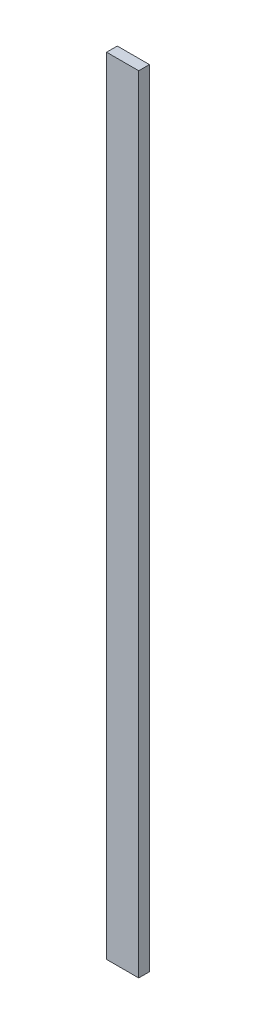
ISO-10303-21;
HEADER;
FILE_DESCRIPTION(('STEP AP214'),'2;1');
FILE_NAME('part.step','',(''),(''),'','','');
FILE_SCHEMA(('AUTOMOTIVE_DESIGN { 1 0 10303 214 1 1 1 1 }'));
ENDSEC;
DATA;
#1=APPLICATION_CONTEXT('core data for automotive mechanical design processes');
#2=APPLICATION_PROTOCOL_DEFINITION('international standard','automotive_design',2000,#1);
#3=PRODUCT_CONTEXT('',#1,'mechanical');
#4=PRODUCT('Part','Part','',(#3));
#5=PRODUCT_RELATED_PRODUCT_CATEGORY('part','',(#4));
#6=PRODUCT_DEFINITION_FORMATION('','',#4);
#7=PRODUCT_DEFINITION_CONTEXT('part definition',#1,'design');
#8=PRODUCT_DEFINITION('design','',#6,#7);
#9=PRODUCT_DEFINITION_SHAPE('','',#8);
#10=(LENGTH_UNIT() NAMED_UNIT(*) SI_UNIT(.MILLI.,.METRE.));
#11=(NAMED_UNIT(*) PLANE_ANGLE_UNIT() SI_UNIT($,.RADIAN.));
#12=(NAMED_UNIT(*) SI_UNIT($,.STERADIAN.) SOLID_ANGLE_UNIT());
#13=UNCERTAINTY_MEASURE_WITH_UNIT(LENGTH_MEASURE(1.E-05),#10,'distance_accuracy_value','');
#14=(GEOMETRIC_REPRESENTATION_CONTEXT(3) GLOBAL_UNCERTAINTY_ASSIGNED_CONTEXT((#13)) GLOBAL_UNIT_ASSIGNED_CONTEXT((#10,
#11,#12)) REPRESENTATION_CONTEXT('',''));
#15=CARTESIAN_POINT('',(0.,0.,0.));
#16=DIRECTION('',(0.,0.,1.));
#17=DIRECTION('',(1.,0.,0.));
#18=AXIS2_PLACEMENT_3D('',#15,#16,#17);
#19=CARTESIAN_POINT('',(2.25,110.,-0.75));
#20=DIRECTION('',(-1.,0.,0.));
#21=DIRECTION('',(0.,0.,1.));
#22=AXIS2_PLACEMENT_3D('',#19,#20,#21);
#23=PLANE('',#22);
#24=DIRECTION('',(0.,0.,-1.));
#25=VECTOR('',#24,1.);
#26=CARTESIAN_POINT('',(2.25,0.,-0.75));
#27=LINE('',#26,#25);
#28=CARTESIAN_POINT('',(2.25,0.,0.75));
#29=VERTEX_POINT('',#28);
#30=CARTESIAN_POINT('',(2.25,0.,-0.75));
#31=VERTEX_POINT('',#30);
#32=EDGE_CURVE('E96',#29,#31,#27,.T.);
#33=ORIENTED_EDGE('',*,*,#32,.T.);
#34=DIRECTION('',(0.,-1.,0.));
#35=VECTOR('',#34,1.);
#36=CARTESIAN_POINT('',(2.25,110.,-0.75));
#37=LINE('',#36,#35);
#38=CARTESIAN_POINT('',(2.25,110.,-0.75));
#39=VERTEX_POINT('',#38);
#40=EDGE_CURVE('E11',#39,#31,#37,.T.);
#41=ORIENTED_EDGE('',*,*,#40,.F.);
#42=DIRECTION('',(0.,0.,-1.));
#43=VECTOR('',#42,1.);
#44=CARTESIAN_POINT('',(2.25,110.,-0.75));
#45=LINE('',#44,#43);
#46=CARTESIAN_POINT('',(2.25,110.,0.75));
#47=VERTEX_POINT('',#46);
#48=EDGE_CURVE('E84',#47,#39,#45,.T.);
#49=ORIENTED_EDGE('',*,*,#48,.F.);
#50=DIRECTION('',(0.,-1.,0.));
#51=VECTOR('',#50,1.);
#52=CARTESIAN_POINT('',(2.25,110.,0.75));
#53=LINE('',#52,#51);
#54=EDGE_CURVE('E92',#47,#29,#53,.T.);
#55=ORIENTED_EDGE('',*,*,#54,.T.);
#56=EDGE_LOOP('',(#33,#41,#49,#55));
#57=FACE_BOUND('',#56,.T.);
#58=ADVANCED_FACE('F33',(#57),#23,.F.);
#59=CARTESIAN_POINT('',(-2.25,110.,-0.75));
#60=DIRECTION('',(0.,0.,1.));
#61=DIRECTION('',(1.,0.,0.));
#62=AXIS2_PLACEMENT_3D('',#59,#60,#61);
#63=PLANE('',#62);
#64=DIRECTION('',(-1.,0.,0.));
#65=VECTOR('',#64,1.);
#66=CARTESIAN_POINT('',(-2.25,0.,-0.75));
#67=LINE('',#66,#65);
#68=CARTESIAN_POINT('',(-2.25,0.,-0.75));
#69=VERTEX_POINT('',#68);
#70=EDGE_CURVE('E88',#31,#69,#67,.T.);
#71=ORIENTED_EDGE('',*,*,#70,.T.);
#72=DIRECTION('',(0.,-1.,0.));
#73=VECTOR('',#72,1.);
#74=CARTESIAN_POINT('',(-2.25,110.,-0.75));
#75=LINE('',#74,#73);
#76=CARTESIAN_POINT('',(-2.25,110.,-0.75));
#77=VERTEX_POINT('',#76);
#78=EDGE_CURVE('E41',#77,#69,#75,.T.);
#79=ORIENTED_EDGE('',*,*,#78,.F.);
#80=DIRECTION('',(-1.,0.,0.));
#81=VECTOR('',#80,1.);
#82=CARTESIAN_POINT('',(-2.25,110.,-0.75));
#83=LINE('',#82,#81);
#84=EDGE_CURVE('E79',#39,#77,#83,.T.);
#85=ORIENTED_EDGE('',*,*,#84,.F.);
#86=ORIENTED_EDGE('',*,*,#40,.T.);
#87=EDGE_LOOP('',(#71,#79,#85,#86));
#88=FACE_BOUND('',#87,.T.);
#89=ADVANCED_FACE('F87',(#88),#63,.F.);
#90=CARTESIAN_POINT('',(-2.25,110.,-0.75));
#91=DIRECTION('',(1.,0.,0.));
#92=DIRECTION('',(0.,0.,-1.));
#93=AXIS2_PLACEMENT_3D('',#90,#91,#92);
#94=PLANE('',#93);
#95=DIRECTION('',(0.,0.,1.));
#96=VECTOR('',#95,1.);
#97=CARTESIAN_POINT('',(-2.25,0.,-0.75));
#98=LINE('',#97,#96);
#99=CARTESIAN_POINT('',(-2.25,0.,0.75));
#100=VERTEX_POINT('',#99);
#101=EDGE_CURVE('E66',#69,#100,#98,.T.);
#102=ORIENTED_EDGE('',*,*,#101,.T.);
#103=DIRECTION('',(0.,-1.,0.));
#104=VECTOR('',#103,1.);
#105=CARTESIAN_POINT('',(-2.25,110.,0.75));
#106=LINE('',#105,#104);
#107=CARTESIAN_POINT('',(-2.25,110.,0.75));
#108=VERTEX_POINT('',#107);
#109=EDGE_CURVE('E89',#108,#100,#106,.T.);
#110=ORIENTED_EDGE('',*,*,#109,.F.);
#111=DIRECTION('',(0.,0.,1.));
#112=VECTOR('',#111,1.);
#113=CARTESIAN_POINT('',(-2.25,110.,-0.75));
#114=LINE('',#113,#112);
#115=EDGE_CURVE('E82',#77,#108,#114,.T.);
#116=ORIENTED_EDGE('',*,*,#115,.F.);
#117=ORIENTED_EDGE('',*,*,#78,.T.);
#118=EDGE_LOOP('',(#102,#110,#116,#117));
#119=FACE_BOUND('',#118,.T.);
#120=ADVANCED_FACE('F90',(#119),#94,.F.);
#121=CARTESIAN_POINT('',(-2.25,110.,0.75));
#122=DIRECTION('',(0.,0.,-1.));
#123=DIRECTION('',(-1.,0.,0.));
#124=AXIS2_PLACEMENT_3D('',#121,#122,#123);
#125=PLANE('',#124);
#126=DIRECTION('',(1.,0.,0.));
#127=VECTOR('',#126,1.);
#128=CARTESIAN_POINT('',(-2.25,0.,0.75));
#129=LINE('',#128,#127);
#130=EDGE_CURVE('E72',#100,#29,#129,.T.);
#131=ORIENTED_EDGE('',*,*,#130,.T.);
#132=ORIENTED_EDGE('',*,*,#54,.F.);
#133=DIRECTION('',(1.,0.,0.));
#134=VECTOR('',#133,1.);
#135=CARTESIAN_POINT('',(-2.25,110.,0.75));
#136=LINE('',#135,#134);
#137=EDGE_CURVE('E49',#108,#47,#136,.T.);
#138=ORIENTED_EDGE('',*,*,#137,.F.);
#139=ORIENTED_EDGE('',*,*,#109,.T.);
#140=EDGE_LOOP('',(#131,#132,#138,#139));
#141=FACE_BOUND('',#140,.T.);
#142=ADVANCED_FACE('F103',(#141),#125,.F.);
#143=CARTESIAN_POINT('',(0.,110.,0.));
#144=DIRECTION('',(0.,1.,0.));
#145=DIRECTION('',(0.,0.,1.));
#146=AXIS2_PLACEMENT_3D('',#143,#144,#145);
#147=PLANE('',#146);
#148=ORIENTED_EDGE('',*,*,#48,.T.);
#149=ORIENTED_EDGE('',*,*,#84,.T.);
#150=ORIENTED_EDGE('',*,*,#115,.T.);
#151=ORIENTED_EDGE('',*,*,#137,.T.);
#152=EDGE_LOOP('',(#148,#149,#150,#151));
#153=FACE_BOUND('',#152,.T.);
#154=ADVANCED_FACE('F80',(#153),#147,.T.);
#155=CARTESIAN_POINT('',(0.,0.,0.));
#156=DIRECTION('',(0.,1.,0.));
#157=DIRECTION('',(0.,0.,1.));
#158=AXIS2_PLACEMENT_3D('',#155,#156,#157);
#159=PLANE('',#158);
#160=ORIENTED_EDGE('',*,*,#32,.F.);
#161=ORIENTED_EDGE('',*,*,#130,.F.);
#162=ORIENTED_EDGE('',*,*,#101,.F.);
#163=ORIENTED_EDGE('',*,*,#70,.F.);
#164=EDGE_LOOP('',(#160,#161,#162,#163));
#165=FACE_BOUND('',#164,.T.);
#166=ADVANCED_FACE('F106',(#165),#159,.F.);
#167=CLOSED_SHELL('',(#58,#89,#120,#142,#154,#166));
#168=MANIFOLD_SOLID_BREP('B2',#167);
#169=ADVANCED_BREP_SHAPE_REPRESENTATION('',(#18,#168),#14);
#170=SHAPE_DEFINITION_REPRESENTATION(#9,#169);
ENDSEC;
END-ISO-10303-21;
